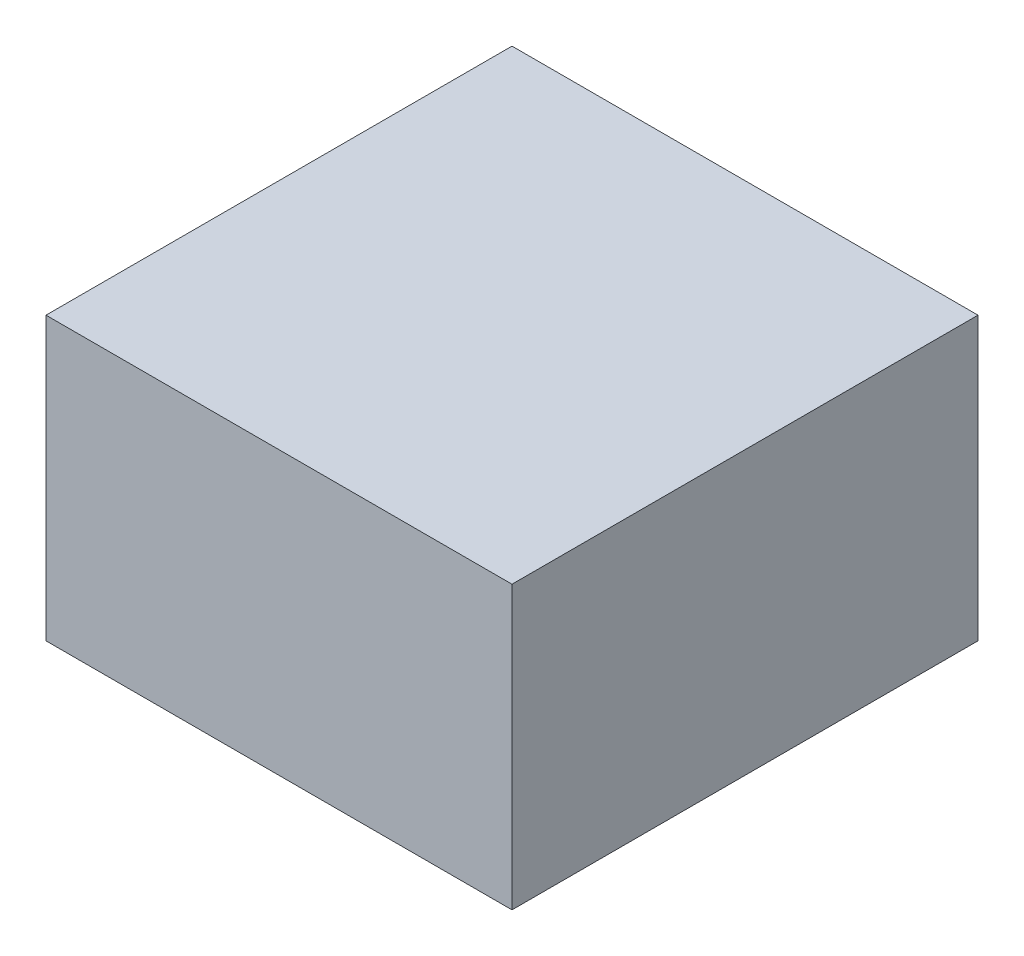
ISO-10303-21;
HEADER;
FILE_DESCRIPTION(('STEP AP214'),'2;1');
FILE_NAME('part.step','',(''),(''),'','','');
FILE_SCHEMA(('AUTOMOTIVE_DESIGN { 1 0 10303 214 1 1 1 1 }'));
ENDSEC;
DATA;
#1=APPLICATION_CONTEXT('core data for automotive mechanical design processes');
#2=APPLICATION_PROTOCOL_DEFINITION('international standard','automotive_design',2000,#1);
#3=PRODUCT_CONTEXT('',#1,'mechanical');
#4=PRODUCT('Part','Part','',(#3));
#5=PRODUCT_RELATED_PRODUCT_CATEGORY('part','',(#4));
#6=PRODUCT_DEFINITION_FORMATION('','',#4);
#7=PRODUCT_DEFINITION_CONTEXT('part definition',#1,'design');
#8=PRODUCT_DEFINITION('design','',#6,#7);
#9=PRODUCT_DEFINITION_SHAPE('','',#8);
#10=(LENGTH_UNIT() NAMED_UNIT(*) SI_UNIT(.MILLI.,.METRE.));
#11=(NAMED_UNIT(*) PLANE_ANGLE_UNIT() SI_UNIT($,.RADIAN.));
#12=(NAMED_UNIT(*) SI_UNIT($,.STERADIAN.) SOLID_ANGLE_UNIT());
#13=UNCERTAINTY_MEASURE_WITH_UNIT(LENGTH_MEASURE(1.E-05),#10,'distance_accuracy_value','');
#14=(GEOMETRIC_REPRESENTATION_CONTEXT(3) GLOBAL_UNCERTAINTY_ASSIGNED_CONTEXT((#13)) GLOBAL_UNIT_ASSIGNED_CONTEXT((#10,
#11,#12)) REPRESENTATION_CONTEXT('',''));
#15=CARTESIAN_POINT('',(0.,0.,0.));
#16=DIRECTION('',(0.,0.,1.));
#17=DIRECTION('',(1.,0.,0.));
#18=AXIS2_PLACEMENT_3D('',#15,#16,#17);
#19=CARTESIAN_POINT('',(-19.,23.,-19.));
#20=DIRECTION('',(0.,0.,-1.));
#21=DIRECTION('',(-1.,0.,0.));
#22=AXIS2_PLACEMENT_3D('',#19,#20,#21);
#23=PLANE('',#22);
#24=DIRECTION('',(1.,0.,0.));
#25=VECTOR('',#24,1.);
#26=CARTESIAN_POINT('',(-19.,0.,-19.));
#27=LINE('',#26,#25);
#28=CARTESIAN_POINT('',(-19.,0.,-19.));
#29=VERTEX_POINT('',#28);
#30=CARTESIAN_POINT('',(19.,0.,-19.));
#31=VERTEX_POINT('',#30);
#32=EDGE_CURVE('E105',#29,#31,#27,.T.);
#33=ORIENTED_EDGE('',*,*,#32,.F.);
#34=DIRECTION('',(0.,-1.,0.));
#35=VECTOR('',#34,1.);
#36=CARTESIAN_POINT('',(-19.,23.,-19.));
#37=LINE('',#36,#35);
#38=CARTESIAN_POINT('',(-19.,23.,-19.));
#39=VERTEX_POINT('',#38);
#40=EDGE_CURVE('E11',#39,#29,#37,.T.);
#41=ORIENTED_EDGE('',*,*,#40,.F.);
#42=DIRECTION('',(1.,0.,0.));
#43=VECTOR('',#42,1.);
#44=CARTESIAN_POINT('',(-19.,23.,-19.));
#45=LINE('',#44,#43);
#46=CARTESIAN_POINT('',(19.,23.,-19.));
#47=VERTEX_POINT('',#46);
#48=EDGE_CURVE('E99',#39,#47,#45,.T.);
#49=ORIENTED_EDGE('',*,*,#48,.T.);
#50=DIRECTION('',(0.,-1.,0.));
#51=VECTOR('',#50,1.);
#52=CARTESIAN_POINT('',(19.,23.,-19.));
#53=LINE('',#52,#51);
#54=EDGE_CURVE('E44',#47,#31,#53,.T.);
#55=ORIENTED_EDGE('',*,*,#54,.T.);
#56=EDGE_LOOP('',(#33,#41,#49,#55));
#57=FACE_BOUND('',#56,.T.);
#58=ADVANCED_FACE('F41',(#57),#23,.T.);
#59=CARTESIAN_POINT('',(-19.,23.,19.));
#60=DIRECTION('',(-1.,0.,0.));
#61=DIRECTION('',(0.,0.,1.));
#62=AXIS2_PLACEMENT_3D('',#59,#60,#61);
#63=PLANE('',#62);
#64=DIRECTION('',(0.,0.,-1.));
#65=VECTOR('',#64,1.);
#66=CARTESIAN_POINT('',(-19.,0.,19.));
#67=LINE('',#66,#65);
#68=CARTESIAN_POINT('',(-19.,0.,19.));
#69=VERTEX_POINT('',#68);
#70=EDGE_CURVE('E101',#69,#29,#67,.T.);
#71=ORIENTED_EDGE('',*,*,#70,.F.);
#72=DIRECTION('',(0.,-1.,0.));
#73=VECTOR('',#72,1.);
#74=CARTESIAN_POINT('',(-19.,23.,19.));
#75=LINE('',#74,#73);
#76=CARTESIAN_POINT('',(-19.,23.,19.));
#77=VERTEX_POINT('',#76);
#78=EDGE_CURVE('E50',#77,#69,#75,.T.);
#79=ORIENTED_EDGE('',*,*,#78,.F.);
#80=DIRECTION('',(0.,0.,-1.));
#81=VECTOR('',#80,1.);
#82=CARTESIAN_POINT('',(-19.,23.,19.));
#83=LINE('',#82,#81);
#84=EDGE_CURVE('E89',#77,#39,#83,.T.);
#85=ORIENTED_EDGE('',*,*,#84,.T.);
#86=ORIENTED_EDGE('',*,*,#40,.T.);
#87=EDGE_LOOP('',(#71,#79,#85,#86));
#88=FACE_BOUND('',#87,.T.);
#89=ADVANCED_FACE('F115',(#88),#63,.T.);
#90=CARTESIAN_POINT('',(-19.,23.,19.));
#91=DIRECTION('',(0.,0.,-1.));
#92=DIRECTION('',(-1.,0.,0.));
#93=AXIS2_PLACEMENT_3D('',#90,#91,#92);
#94=PLANE('',#93);
#95=DIRECTION('',(1.,0.,0.));
#96=VECTOR('',#95,1.);
#97=CARTESIAN_POINT('',(-19.,0.,19.));
#98=LINE('',#97,#96);
#99=CARTESIAN_POINT('',(19.,0.,19.));
#100=VERTEX_POINT('',#99);
#101=EDGE_CURVE('E94',#69,#100,#98,.T.);
#102=ORIENTED_EDGE('',*,*,#101,.T.);
#103=DIRECTION('',(0.,-1.,0.));
#104=VECTOR('',#103,1.);
#105=CARTESIAN_POINT('',(19.,23.,19.));
#106=LINE('',#105,#104);
#107=CARTESIAN_POINT('',(19.,23.,19.));
#108=VERTEX_POINT('',#107);
#109=EDGE_CURVE('E92',#108,#100,#106,.T.);
#110=ORIENTED_EDGE('',*,*,#109,.F.);
#111=DIRECTION('',(1.,0.,0.));
#112=VECTOR('',#111,1.);
#113=CARTESIAN_POINT('',(-19.,23.,19.));
#114=LINE('',#113,#112);
#115=EDGE_CURVE('E86',#77,#108,#114,.T.);
#116=ORIENTED_EDGE('',*,*,#115,.F.);
#117=ORIENTED_EDGE('',*,*,#78,.T.);
#118=EDGE_LOOP('',(#102,#110,#116,#117));
#119=FACE_BOUND('',#118,.T.);
#120=ADVANCED_FACE('F93',(#119),#94,.F.);
#121=CARTESIAN_POINT('',(19.,23.,19.));
#122=DIRECTION('',(-1.,0.,0.));
#123=DIRECTION('',(0.,0.,1.));
#124=AXIS2_PLACEMENT_3D('',#121,#122,#123);
#125=PLANE('',#124);
#126=DIRECTION('',(0.,0.,-1.));
#127=VECTOR('',#126,1.);
#128=CARTESIAN_POINT('',(19.,0.,19.));
#129=LINE('',#128,#127);
#130=EDGE_CURVE('E108',#100,#31,#129,.T.);
#131=ORIENTED_EDGE('',*,*,#130,.T.);
#132=ORIENTED_EDGE('',*,*,#54,.F.);
#133=DIRECTION('',(0.,0.,-1.));
#134=VECTOR('',#133,1.);
#135=CARTESIAN_POINT('',(19.,23.,19.));
#136=LINE('',#135,#134);
#137=EDGE_CURVE('E83',#108,#47,#136,.T.);
#138=ORIENTED_EDGE('',*,*,#137,.F.);
#139=ORIENTED_EDGE('',*,*,#109,.T.);
#140=EDGE_LOOP('',(#131,#132,#138,#139));
#141=FACE_BOUND('',#140,.T.);
#142=ADVANCED_FACE('F98',(#141),#125,.F.);
#143=CARTESIAN_POINT('',(0.,23.,0.));
#144=DIRECTION('',(0.,1.,0.));
#145=DIRECTION('',(0.,0.,1.));
#146=AXIS2_PLACEMENT_3D('',#143,#144,#145);
#147=PLANE('',#146);
#148=ORIENTED_EDGE('',*,*,#48,.F.);
#149=ORIENTED_EDGE('',*,*,#84,.F.);
#150=ORIENTED_EDGE('',*,*,#115,.T.);
#151=ORIENTED_EDGE('',*,*,#137,.T.);
#152=EDGE_LOOP('',(#148,#149,#150,#151));
#153=FACE_BOUND('',#152,.T.);
#154=ADVANCED_FACE('F88',(#153),#147,.T.);
#155=CARTESIAN_POINT('',(0.,0.,0.));
#156=DIRECTION('',(0.,1.,0.));
#157=DIRECTION('',(0.,0.,1.));
#158=AXIS2_PLACEMENT_3D('',#155,#156,#157);
#159=PLANE('',#158);
#160=ORIENTED_EDGE('',*,*,#32,.T.);
#161=ORIENTED_EDGE('',*,*,#130,.F.);
#162=ORIENTED_EDGE('',*,*,#101,.F.);
#163=ORIENTED_EDGE('',*,*,#70,.T.);
#164=EDGE_LOOP('',(#160,#161,#162,#163));
#165=FACE_BOUND('',#164,.T.);
#166=ADVANCED_FACE('F114',(#165),#159,.F.);
#167=CLOSED_SHELL('',(#58,#89,#120,#142,#154,#166));
#168=MANIFOLD_SOLID_BREP('B2',#167);
#169=ADVANCED_BREP_SHAPE_REPRESENTATION('',(#18,#168),#14);
#170=SHAPE_DEFINITION_REPRESENTATION(#9,#169);
ENDSEC;
END-ISO-10303-21;
